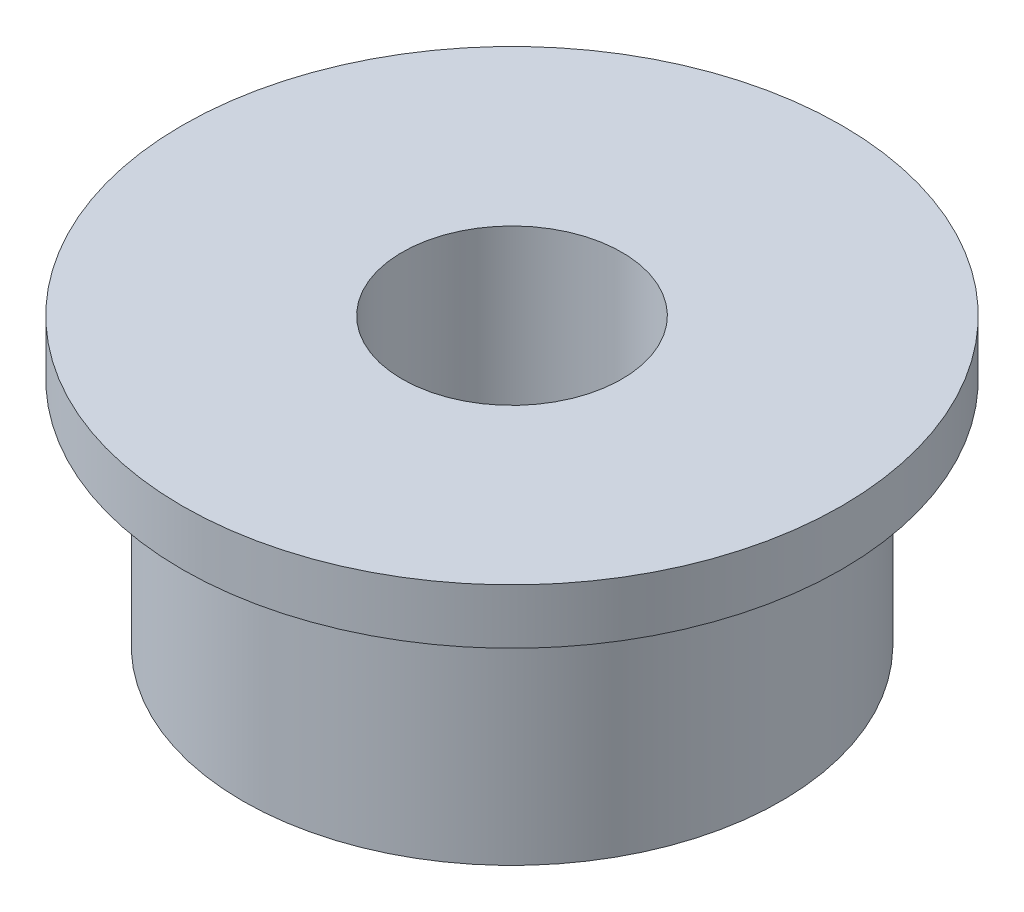
ISO-10303-21;
HEADER;
FILE_DESCRIPTION(('STEP AP214'),'2;1');
FILE_NAME('part.step','',(''),(''),'','','');
FILE_SCHEMA(('AUTOMOTIVE_DESIGN { 1 0 10303 214 1 1 1 1 }'));
ENDSEC;
DATA;
#1=APPLICATION_CONTEXT('core data for automotive mechanical design processes');
#2=APPLICATION_PROTOCOL_DEFINITION('international standard','automotive_design',2000,#1);
#3=PRODUCT_CONTEXT('',#1,'mechanical');
#4=PRODUCT('Part','Part','',(#3));
#5=PRODUCT_RELATED_PRODUCT_CATEGORY('part','',(#4));
#6=PRODUCT_DEFINITION_FORMATION('','',#4);
#7=PRODUCT_DEFINITION_CONTEXT('part definition',#1,'design');
#8=PRODUCT_DEFINITION('design','',#6,#7);
#9=PRODUCT_DEFINITION_SHAPE('','',#8);
#10=(LENGTH_UNIT() NAMED_UNIT(*) SI_UNIT(.MILLI.,.METRE.));
#11=(NAMED_UNIT(*) PLANE_ANGLE_UNIT() SI_UNIT($,.RADIAN.));
#12=(NAMED_UNIT(*) SI_UNIT($,.STERADIAN.) SOLID_ANGLE_UNIT());
#13=UNCERTAINTY_MEASURE_WITH_UNIT(LENGTH_MEASURE(1.E-05),#10,'distance_accuracy_value','');
#14=(GEOMETRIC_REPRESENTATION_CONTEXT(3) GLOBAL_UNCERTAINTY_ASSIGNED_CONTEXT((#13)) GLOBAL_UNIT_ASSIGNED_CONTEXT((#10,
#11,#12)) REPRESENTATION_CONTEXT('',''));
#15=CARTESIAN_POINT('',(0.,0.,0.));
#16=DIRECTION('',(0.,0.,1.));
#17=DIRECTION('',(1.,0.,0.));
#18=AXIS2_PLACEMENT_3D('',#15,#16,#17);
#19=CARTESIAN_POINT('',(0.,-6.5,5.));
#20=DIRECTION('',(0.,-1.,0.));
#21=DIRECTION('',(0.,0.,-1.));
#22=AXIS2_PLACEMENT_3D('',#19,#20,#21);
#23=PLANE('',#22);
#24=CARTESIAN_POINT('',(0.,-6.5,0.));
#25=DIRECTION('',(0.,1.,0.));
#26=DIRECTION('',(0.,0.,1.));
#27=AXIS2_PLACEMENT_3D('',#24,#25,#26);
#28=CIRCLE('',#27,5.);
#29=CARTESIAN_POINT('',(0.,-6.5,5.));
#30=VERTEX_POINT('',#29);
#31=EDGE_CURVE('E53',#30,#30,#28,.T.);
#32=ORIENTED_EDGE('',*,*,#31,.T.);
#33=EDGE_LOOP('',(#32));
#34=FACE_BOUND('',#33,.T.);
#35=CARTESIAN_POINT('',(0.,-6.5,0.));
#36=DIRECTION('',(0.,1.,0.));
#37=DIRECTION('',(0.,0.,1.));
#38=AXIS2_PLACEMENT_3D('',#35,#36,#37);
#39=CIRCLE('',#38,12.25);
#40=CARTESIAN_POINT('',(0.,-6.5,12.25));
#41=VERTEX_POINT('',#40);
#42=EDGE_CURVE('E10',#41,#41,#39,.T.);
#43=ORIENTED_EDGE('',*,*,#42,.F.);
#44=EDGE_LOOP('',(#43));
#45=FACE_BOUND('',#44,.T.);
#46=ADVANCED_FACE('F31',(#34,#45),#23,.T.);
#47=CARTESIAN_POINT('',(0.,22.4532313440269,0.));
#48=DIRECTION('',(0.,1.,0.));
#49=DIRECTION('',(0.,0.,1.));
#50=AXIS2_PLACEMENT_3D('',#47,#48,#49);
#51=CYLINDRICAL_SURFACE('',#50,12.25);
#52=ORIENTED_EDGE('',*,*,#42,.T.);
#53=EDGE_LOOP('',(#52));
#54=FACE_BOUND('',#53,.T.);
#55=CARTESIAN_POINT('',(0.,4.,0.));
#56=DIRECTION('',(0.,1.,0.));
#57=DIRECTION('',(0.,0.,1.));
#58=AXIS2_PLACEMENT_3D('',#55,#56,#57);
#59=CIRCLE('',#58,12.25);
#60=CARTESIAN_POINT('',(0.,4.,12.25));
#61=VERTEX_POINT('',#60);
#62=EDGE_CURVE('E37',#61,#61,#59,.T.);
#63=ORIENTED_EDGE('',*,*,#62,.F.);
#64=EDGE_LOOP('',(#63));
#65=FACE_BOUND('',#64,.T.);
#66=ADVANCED_FACE('F71',(#54,#65),#51,.T.);
#67=CARTESIAN_POINT('',(0.,4.,12.25));
#68=DIRECTION('',(0.,-1.,0.));
#69=DIRECTION('',(0.,0.,-1.));
#70=AXIS2_PLACEMENT_3D('',#67,#68,#69);
#71=PLANE('',#70);
#72=ORIENTED_EDGE('',*,*,#62,.T.);
#73=EDGE_LOOP('',(#72));
#74=FACE_BOUND('',#73,.T.);
#75=CARTESIAN_POINT('',(0.,4.,0.));
#76=DIRECTION('',(0.,1.,0.));
#77=DIRECTION('',(0.,0.,1.));
#78=AXIS2_PLACEMENT_3D('',#75,#76,#77);
#79=CIRCLE('',#78,15.);
#80=CARTESIAN_POINT('',(0.,4.,15.));
#81=VERTEX_POINT('',#80);
#82=EDGE_CURVE('E41',#81,#81,#79,.T.);
#83=ORIENTED_EDGE('',*,*,#82,.F.);
#84=EDGE_LOOP('',(#83));
#85=FACE_BOUND('',#84,.T.);
#86=ADVANCED_FACE('F75',(#74,#85),#71,.T.);
#87=CARTESIAN_POINT('',(0.,22.4532313440269,0.));
#88=DIRECTION('',(0.,1.,0.));
#89=DIRECTION('',(0.,0.,1.));
#90=AXIS2_PLACEMENT_3D('',#87,#88,#89);
#91=CYLINDRICAL_SURFACE('',#90,15.);
#92=ORIENTED_EDGE('',*,*,#82,.T.);
#93=EDGE_LOOP('',(#92));
#94=FACE_BOUND('',#93,.T.);
#95=CARTESIAN_POINT('',(0.,6.5,0.));
#96=DIRECTION('',(0.,1.,0.));
#97=DIRECTION('',(0.,0.,1.));
#98=AXIS2_PLACEMENT_3D('',#95,#96,#97);
#99=CIRCLE('',#98,15.);
#100=CARTESIAN_POINT('',(0.,6.5,15.));
#101=VERTEX_POINT('',#100);
#102=EDGE_CURVE('E45',#101,#101,#99,.T.);
#103=ORIENTED_EDGE('',*,*,#102,.F.);
#104=EDGE_LOOP('',(#103));
#105=FACE_BOUND('',#104,.T.);
#106=ADVANCED_FACE('F67',(#94,#105),#91,.T.);
#107=CARTESIAN_POINT('',(0.,6.5,15.));
#108=DIRECTION('',(0.,1.,0.));
#109=DIRECTION('',(0.,0.,1.));
#110=AXIS2_PLACEMENT_3D('',#107,#108,#109);
#111=PLANE('',#110);
#112=ORIENTED_EDGE('',*,*,#102,.T.);
#113=EDGE_LOOP('',(#112));
#114=FACE_BOUND('',#113,.T.);
#115=CARTESIAN_POINT('',(0.,6.5,0.));
#116=DIRECTION('',(0.,1.,0.));
#117=DIRECTION('',(0.,0.,1.));
#118=AXIS2_PLACEMENT_3D('',#115,#116,#117);
#119=CIRCLE('',#118,5.);
#120=CARTESIAN_POINT('',(0.,6.5,5.));
#121=VERTEX_POINT('',#120);
#122=EDGE_CURVE('E50',#121,#121,#119,.T.);
#123=ORIENTED_EDGE('',*,*,#122,.F.);
#124=EDGE_LOOP('',(#123));
#125=FACE_BOUND('',#124,.T.);
#126=ADVANCED_FACE('F61',(#114,#125),#111,.T.);
#127=CARTESIAN_POINT('',(0.,22.4532313440269,0.));
#128=DIRECTION('',(0.,1.,0.));
#129=DIRECTION('',(0.,0.,1.));
#130=AXIS2_PLACEMENT_3D('',#127,#128,#129);
#131=CYLINDRICAL_SURFACE('',#130,5.);
#132=ORIENTED_EDGE('',*,*,#122,.T.);
#133=EDGE_LOOP('',(#132));
#134=FACE_BOUND('',#133,.T.);
#135=ORIENTED_EDGE('',*,*,#31,.F.);
#136=EDGE_LOOP('',(#135));
#137=FACE_BOUND('',#136,.T.);
#138=ADVANCED_FACE('F59',(#134,#137),#131,.F.);
#139=CLOSED_SHELL('',(#46,#66,#86,#106,#126,#138));
#140=MANIFOLD_SOLID_BREP('B2',#139);
#141=ADVANCED_BREP_SHAPE_REPRESENTATION('',(#18,#140),#14);
#142=SHAPE_DEFINITION_REPRESENTATION(#9,#141);
ENDSEC;
END-ISO-10303-21;
